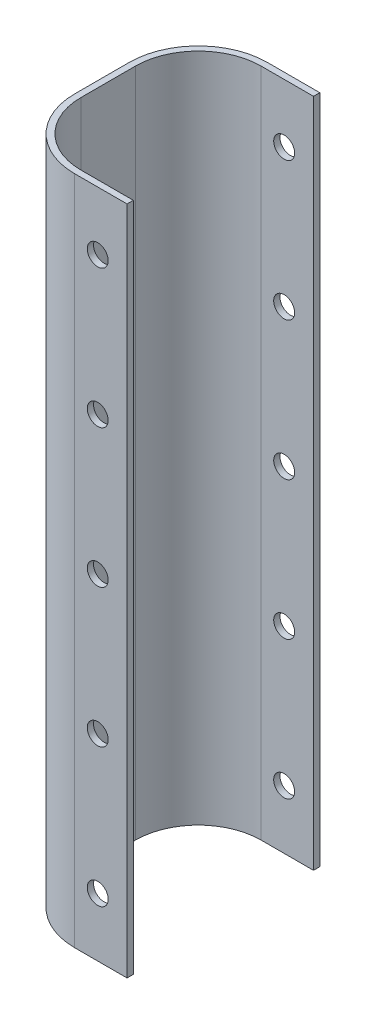
ISO-10303-21;
HEADER;
FILE_DESCRIPTION(('STEP AP214'),'2;1');
FILE_NAME('part.step','',(''),(''),'','','');
FILE_SCHEMA(('AUTOMOTIVE_DESIGN { 1 0 10303 214 1 1 1 1 }'));
ENDSEC;
DATA;
#1=APPLICATION_CONTEXT('core data for automotive mechanical design processes');
#2=APPLICATION_PROTOCOL_DEFINITION('international standard','automotive_design',2000,#1);
#3=PRODUCT_CONTEXT('',#1,'mechanical');
#4=PRODUCT('Part','Part','',(#3));
#5=PRODUCT_RELATED_PRODUCT_CATEGORY('part','',(#4));
#6=PRODUCT_DEFINITION_FORMATION('','',#4);
#7=PRODUCT_DEFINITION_CONTEXT('part definition',#1,'design');
#8=PRODUCT_DEFINITION('design','',#6,#7);
#9=PRODUCT_DEFINITION_SHAPE('','',#8);
#10=(LENGTH_UNIT() NAMED_UNIT(*) SI_UNIT(.MILLI.,.METRE.));
#11=(NAMED_UNIT(*) PLANE_ANGLE_UNIT() SI_UNIT($,.RADIAN.));
#12=(NAMED_UNIT(*) SI_UNIT($,.STERADIAN.) SOLID_ANGLE_UNIT());
#13=UNCERTAINTY_MEASURE_WITH_UNIT(LENGTH_MEASURE(1.E-05),#10,'distance_accuracy_value','');
#14=(GEOMETRIC_REPRESENTATION_CONTEXT(3) GLOBAL_UNCERTAINTY_ASSIGNED_CONTEXT((#13)) GLOBAL_UNIT_ASSIGNED_CONTEXT((#10,
#11,#12)) REPRESENTATION_CONTEXT('',''));
#15=CARTESIAN_POINT('',(0.,0.,0.));
#16=DIRECTION('',(0.,0.,1.));
#17=DIRECTION('',(1.,0.,0.));
#18=AXIS2_PLACEMENT_3D('',#15,#16,#17);
#19=CARTESIAN_POINT('',(0.,160.,0.));
#20=DIRECTION('',(-1.,0.,0.));
#21=DIRECTION('',(0.,0.,1.));
#22=AXIS2_PLACEMENT_3D('',#19,#20,#21);
#23=PLANE('',#22);
#24=DIRECTION('',(0.,0.,-1.));
#25=VECTOR('',#24,1.);
#26=CARTESIAN_POINT('',(0.,0.,0.));
#27=LINE('',#26,#25);
#28=CARTESIAN_POINT('',(0.,0.,0.));
#29=VERTEX_POINT('',#28);
#30=CARTESIAN_POINT('',(0.,0.,-1.5));
#31=VERTEX_POINT('',#30);
#32=EDGE_CURVE('E157',#29,#31,#27,.T.);
#33=ORIENTED_EDGE('',*,*,#32,.T.);
#34=DIRECTION('',(0.,-1.,0.));
#35=VECTOR('',#34,1.);
#36=CARTESIAN_POINT('',(0.,160.,-1.5));
#37=LINE('',#36,#35);
#38=CARTESIAN_POINT('',(0.,160.,-1.5));
#39=VERTEX_POINT('',#38);
#40=EDGE_CURVE('E11',#39,#31,#37,.T.);
#41=ORIENTED_EDGE('',*,*,#40,.F.);
#42=DIRECTION('',(0.,0.,-1.));
#43=VECTOR('',#42,1.);
#44=CARTESIAN_POINT('',(0.,160.,0.));
#45=LINE('',#44,#43);
#46=CARTESIAN_POINT('',(0.,160.,0.));
#47=VERTEX_POINT('',#46);
#48=EDGE_CURVE('E180',#47,#39,#45,.T.);
#49=ORIENTED_EDGE('',*,*,#48,.F.);
#50=DIRECTION('',(0.,-1.,0.));
#51=VECTOR('',#50,1.);
#52=CARTESIAN_POINT('',(0.,160.,0.));
#53=LINE('',#52,#51);
#54=EDGE_CURVE('E153',#47,#29,#53,.T.);
#55=ORIENTED_EDGE('',*,*,#54,.T.);
#56=EDGE_LOOP('',(#33,#41,#49,#55));
#57=FACE_BOUND('',#56,.T.);
#58=ADVANCED_FACE('F35',(#57),#23,.F.);
#59=CARTESIAN_POINT('',(0.,160.,-1.5));
#60=DIRECTION('',(0.,0.,1.));
#61=DIRECTION('',(1.,0.,0.));
#62=AXIS2_PLACEMENT_3D('',#59,#60,#61);
#63=PLANE('',#62);
#64=CARTESIAN_POINT('',(-6.99999999999999,113.,-1.5));
#65=DIRECTION('',(0.,0.,1.));
#66=DIRECTION('',(-1.,0.,0.));
#67=AXIS2_PLACEMENT_3D('',#64,#65,#66);
#68=CIRCLE('',#67,2.5);
#69=CARTESIAN_POINT('',(-9.5,113.,-1.5));
#70=VERTEX_POINT('',#69);
#71=EDGE_CURVE('E478',#70,#70,#68,.T.);
#72=ORIENTED_EDGE('',*,*,#71,.T.);
#73=EDGE_LOOP('',(#72));
#74=FACE_BOUND('',#73,.T.);
#75=CARTESIAN_POINT('',(-7.,146.,-1.5));
#76=DIRECTION('',(0.,0.,1.));
#77=DIRECTION('',(-1.,0.,0.));
#78=AXIS2_PLACEMENT_3D('',#75,#76,#77);
#79=CIRCLE('',#78,2.50000000000001);
#80=CARTESIAN_POINT('',(-9.50000000000001,146.,-1.5));
#81=VERTEX_POINT('',#80);
#82=EDGE_CURVE('E483',#81,#81,#79,.T.);
#83=ORIENTED_EDGE('',*,*,#82,.T.);
#84=EDGE_LOOP('',(#83));
#85=FACE_BOUND('',#84,.T.);
#86=CARTESIAN_POINT('',(-6.99999999999998,14.,-1.5));
#87=DIRECTION('',(0.,0.,1.));
#88=DIRECTION('',(1.,0.,0.));
#89=AXIS2_PLACEMENT_3D('',#86,#87,#88);
#90=CIRCLE('',#89,2.5);
#91=CARTESIAN_POINT('',(-4.49999999999998,14.,-1.5));
#92=VERTEX_POINT('',#91);
#93=EDGE_CURVE('E489',#92,#92,#90,.T.);
#94=ORIENTED_EDGE('',*,*,#93,.T.);
#95=EDGE_LOOP('',(#94));
#96=FACE_BOUND('',#95,.T.);
#97=CARTESIAN_POINT('',(-6.99999999999999,47.,-1.5));
#98=DIRECTION('',(0.,0.,1.));
#99=DIRECTION('',(1.,0.,0.));
#100=AXIS2_PLACEMENT_3D('',#97,#98,#99);
#101=CIRCLE('',#100,2.5);
#102=CARTESIAN_POINT('',(-4.49999999999999,47.,-1.5));
#103=VERTEX_POINT('',#102);
#104=EDGE_CURVE('E474',#103,#103,#101,.T.);
#105=ORIENTED_EDGE('',*,*,#104,.T.);
#106=EDGE_LOOP('',(#105));
#107=FACE_BOUND('',#106,.T.);
#108=CARTESIAN_POINT('',(-6.99999999999999,80.,-1.5));
#109=DIRECTION('',(0.,0.,1.));
#110=DIRECTION('',(1.,0.,0.));
#111=AXIS2_PLACEMENT_3D('',#108,#109,#110);
#112=CIRCLE('',#111,2.5);
#113=CARTESIAN_POINT('',(-4.49999999999999,80.,-1.5));
#114=VERTEX_POINT('',#113);
#115=EDGE_CURVE('E208',#114,#114,#112,.T.);
#116=ORIENTED_EDGE('',*,*,#115,.T.);
#117=EDGE_LOOP('',(#116));
#118=FACE_BOUND('',#117,.T.);
#119=DIRECTION('',(-1.,0.,0.));
#120=VECTOR('',#119,1.);
#121=CARTESIAN_POINT('',(0.,0.,-1.5));
#122=LINE('',#121,#120);
#123=CARTESIAN_POINT('',(-12.5,0.,-1.5));
#124=VERTEX_POINT('',#123);
#125=EDGE_CURVE('E160',#31,#124,#122,.T.);
#126=ORIENTED_EDGE('',*,*,#125,.T.);
#127=DIRECTION('',(0.,-1.,0.));
#128=VECTOR('',#127,1.);
#129=CARTESIAN_POINT('',(-12.5,160.,-1.5));
#130=LINE('',#129,#128);
#131=CARTESIAN_POINT('',(-12.5,160.,-1.5));
#132=VERTEX_POINT('',#131);
#133=EDGE_CURVE('E44',#132,#124,#130,.T.);
#134=ORIENTED_EDGE('',*,*,#133,.F.);
#135=DIRECTION('',(-1.,0.,0.));
#136=VECTOR('',#135,1.);
#137=CARTESIAN_POINT('',(0.,160.,-1.5));
#138=LINE('',#137,#136);
#139=EDGE_CURVE('E108',#39,#132,#138,.T.);
#140=ORIENTED_EDGE('',*,*,#139,.F.);
#141=ORIENTED_EDGE('',*,*,#40,.T.);
#142=EDGE_LOOP('',(#126,#134,#140,#141));
#143=FACE_BOUND('',#142,.T.);
#144=ADVANCED_FACE('F275',(#74,#85,#96,#107,#118,#143),#63,.F.);
#145=CARTESIAN_POINT('',(-12.5,160.,15.));
#146=DIRECTION('',(0.,-1.,0.));
#147=DIRECTION('',(0.,0.,-1.));
#148=AXIS2_PLACEMENT_3D('',#145,#146,#147);
#149=CYLINDRICAL_SURFACE('',#148,16.5);
#150=CARTESIAN_POINT('',(-12.5,0.,15.));
#151=DIRECTION('',(0.,1.,0.));
#152=DIRECTION('',(0.,0.,-1.));
#153=AXIS2_PLACEMENT_3D('',#150,#151,#152);
#154=CIRCLE('',#153,16.5);
#155=CARTESIAN_POINT('',(-29.,0.,15.));
#156=VERTEX_POINT('',#155);
#157=EDGE_CURVE('E163',#124,#156,#154,.T.);
#158=ORIENTED_EDGE('',*,*,#157,.T.);
#159=DIRECTION('',(0.,-1.,0.));
#160=VECTOR('',#159,1.);
#161=CARTESIAN_POINT('',(-29.,160.,15.));
#162=LINE('',#161,#160);
#163=CARTESIAN_POINT('',(-29.,160.,15.));
#164=VERTEX_POINT('',#163);
#165=EDGE_CURVE('E199',#164,#156,#162,.T.);
#166=ORIENTED_EDGE('',*,*,#165,.F.);
#167=CARTESIAN_POINT('',(-12.5,160.,15.));
#168=DIRECTION('',(0.,1.,0.));
#169=DIRECTION('',(0.,0.,-1.));
#170=AXIS2_PLACEMENT_3D('',#167,#168,#169);
#171=CIRCLE('',#170,16.5);
#172=EDGE_CURVE('E234',#132,#164,#171,.T.);
#173=ORIENTED_EDGE('',*,*,#172,.F.);
#174=ORIENTED_EDGE('',*,*,#133,.T.);
#175=EDGE_LOOP('',(#158,#166,#173,#174));
#176=FACE_BOUND('',#175,.T.);
#177=ADVANCED_FACE('F279',(#176),#149,.T.);
#178=CARTESIAN_POINT('',(-29.,160.,15.));
#179=DIRECTION('',(1.,0.,0.));
#180=DIRECTION('',(0.,0.,-1.));
#181=AXIS2_PLACEMENT_3D('',#178,#179,#180);
#182=PLANE('',#181);
#183=DIRECTION('',(0.,0.,1.));
#184=VECTOR('',#183,1.);
#185=CARTESIAN_POINT('',(-29.,0.,15.));
#186=LINE('',#185,#184);
#187=CARTESIAN_POINT('',(-29.,0.,28.));
#188=VERTEX_POINT('',#187);
#189=EDGE_CURVE('E165',#156,#188,#186,.T.);
#190=ORIENTED_EDGE('',*,*,#189,.T.);
#191=DIRECTION('',(0.,-1.,0.));
#192=VECTOR('',#191,1.);
#193=CARTESIAN_POINT('',(-29.,160.,28.));
#194=LINE('',#193,#192);
#195=CARTESIAN_POINT('',(-29.,160.,28.));
#196=VERTEX_POINT('',#195);
#197=EDGE_CURVE('E196',#196,#188,#194,.T.);
#198=ORIENTED_EDGE('',*,*,#197,.F.);
#199=DIRECTION('',(0.,0.,1.));
#200=VECTOR('',#199,1.);
#201=CARTESIAN_POINT('',(-29.,160.,15.));
#202=LINE('',#201,#200);
#203=EDGE_CURVE('E236',#164,#196,#202,.T.);
#204=ORIENTED_EDGE('',*,*,#203,.F.);
#205=ORIENTED_EDGE('',*,*,#165,.T.);
#206=EDGE_LOOP('',(#190,#198,#204,#205));
#207=FACE_BOUND('',#206,.T.);
#208=ADVANCED_FACE('F284',(#207),#182,.F.);
#209=CARTESIAN_POINT('',(-12.5,160.,28.));
#210=DIRECTION('',(0.,-1.,0.));
#211=DIRECTION('',(0.,0.,-1.));
#212=AXIS2_PLACEMENT_3D('',#209,#210,#211);
#213=CYLINDRICAL_SURFACE('',#212,16.5);
#214=CARTESIAN_POINT('',(-12.5,0.,28.));
#215=DIRECTION('',(0.,1.,0.));
#216=DIRECTION('',(0.,0.,-1.));
#217=AXIS2_PLACEMENT_3D('',#214,#215,#216);
#218=CIRCLE('',#217,16.5);
#219=CARTESIAN_POINT('',(-12.5,0.,44.5));
#220=VERTEX_POINT('',#219);
#221=EDGE_CURVE('E167',#188,#220,#218,.T.);
#222=ORIENTED_EDGE('',*,*,#221,.T.);
#223=DIRECTION('',(0.,-1.,0.));
#224=VECTOR('',#223,1.);
#225=CARTESIAN_POINT('',(-12.5,160.,44.5));
#226=LINE('',#225,#224);
#227=CARTESIAN_POINT('',(-12.5,160.,44.5));
#228=VERTEX_POINT('',#227);
#229=EDGE_CURVE('E193',#228,#220,#226,.T.);
#230=ORIENTED_EDGE('',*,*,#229,.F.);
#231=CARTESIAN_POINT('',(-12.5,160.,28.));
#232=DIRECTION('',(0.,1.,0.));
#233=DIRECTION('',(0.,0.,-1.));
#234=AXIS2_PLACEMENT_3D('',#231,#232,#233);
#235=CIRCLE('',#234,16.5);
#236=EDGE_CURVE('E238',#196,#228,#235,.T.);
#237=ORIENTED_EDGE('',*,*,#236,.F.);
#238=ORIENTED_EDGE('',*,*,#197,.T.);
#239=EDGE_LOOP('',(#222,#230,#237,#238));
#240=FACE_BOUND('',#239,.T.);
#241=ADVANCED_FACE('F292',(#240),#213,.T.);
#242=CARTESIAN_POINT('',(-12.5,160.,44.5));
#243=DIRECTION('',(0.,0.,-1.));
#244=DIRECTION('',(-1.,0.,0.));
#245=AXIS2_PLACEMENT_3D('',#242,#243,#244);
#246=PLANE('',#245);
#247=CARTESIAN_POINT('',(-6.99999999999999,113.,44.5));
#248=DIRECTION('',(0.,0.,1.));
#249=DIRECTION('',(-1.,0.,0.));
#250=AXIS2_PLACEMENT_3D('',#247,#248,#249);
#251=CIRCLE('',#250,2.5);
#252=CARTESIAN_POINT('',(-9.5,113.,44.5));
#253=VERTEX_POINT('',#252);
#254=EDGE_CURVE('E459',#253,#253,#251,.T.);
#255=ORIENTED_EDGE('',*,*,#254,.F.);
#256=EDGE_LOOP('',(#255));
#257=FACE_BOUND('',#256,.T.);
#258=CARTESIAN_POINT('',(-7.,146.,44.5));
#259=DIRECTION('',(0.,0.,1.));
#260=DIRECTION('',(-1.,0.,0.));
#261=AXIS2_PLACEMENT_3D('',#258,#259,#260);
#262=CIRCLE('',#261,2.50000000000001);
#263=CARTESIAN_POINT('',(-9.50000000000001,146.,44.5));
#264=VERTEX_POINT('',#263);
#265=EDGE_CURVE('E480',#264,#264,#262,.T.);
#266=ORIENTED_EDGE('',*,*,#265,.F.);
#267=EDGE_LOOP('',(#266));
#268=FACE_BOUND('',#267,.T.);
#269=CARTESIAN_POINT('',(-6.99999999999998,14.,44.5));
#270=DIRECTION('',(0.,0.,1.));
#271=DIRECTION('',(1.,0.,0.));
#272=AXIS2_PLACEMENT_3D('',#269,#270,#271);
#273=CIRCLE('',#272,2.5);
#274=CARTESIAN_POINT('',(-4.49999999999998,14.,44.5));
#275=VERTEX_POINT('',#274);
#276=EDGE_CURVE('E486',#275,#275,#273,.T.);
#277=ORIENTED_EDGE('',*,*,#276,.F.);
#278=EDGE_LOOP('',(#277));
#279=FACE_BOUND('',#278,.T.);
#280=CARTESIAN_POINT('',(-6.99999999999999,47.,44.5));
#281=DIRECTION('',(0.,0.,1.));
#282=DIRECTION('',(1.,0.,0.));
#283=AXIS2_PLACEMENT_3D('',#280,#281,#282);
#284=CIRCLE('',#283,2.5);
#285=CARTESIAN_POINT('',(-4.49999999999999,47.,44.5));
#286=VERTEX_POINT('',#285);
#287=EDGE_CURVE('E492',#286,#286,#284,.T.);
#288=ORIENTED_EDGE('',*,*,#287,.F.);
#289=EDGE_LOOP('',(#288));
#290=FACE_BOUND('',#289,.T.);
#291=CARTESIAN_POINT('',(-6.99999999999999,80.,44.5));
#292=DIRECTION('',(0.,0.,1.));
#293=DIRECTION('',(1.,0.,0.));
#294=AXIS2_PLACEMENT_3D('',#291,#292,#293);
#295=CIRCLE('',#294,2.5);
#296=CARTESIAN_POINT('',(-4.49999999999999,80.,44.5));
#297=VERTEX_POINT('',#296);
#298=EDGE_CURVE('E471',#297,#297,#295,.T.);
#299=ORIENTED_EDGE('',*,*,#298,.F.);
#300=EDGE_LOOP('',(#299));
#301=FACE_BOUND('',#300,.T.);
#302=DIRECTION('',(1.,0.,0.));
#303=VECTOR('',#302,1.);
#304=CARTESIAN_POINT('',(-12.5,0.,44.5));
#305=LINE('',#304,#303);
#306=CARTESIAN_POINT('',(0.,0.,44.5));
#307=VERTEX_POINT('',#306);
#308=EDGE_CURVE('E169',#220,#307,#305,.T.);
#309=ORIENTED_EDGE('',*,*,#308,.T.);
#310=DIRECTION('',(0.,-1.,0.));
#311=VECTOR('',#310,1.);
#312=CARTESIAN_POINT('',(0.,160.,44.5));
#313=LINE('',#312,#311);
#314=CARTESIAN_POINT('',(0.,160.,44.5));
#315=VERTEX_POINT('',#314);
#316=EDGE_CURVE('E190',#315,#307,#313,.T.);
#317=ORIENTED_EDGE('',*,*,#316,.F.);
#318=DIRECTION('',(1.,0.,0.));
#319=VECTOR('',#318,1.);
#320=CARTESIAN_POINT('',(-12.5,160.,44.5));
#321=LINE('',#320,#319);
#322=EDGE_CURVE('E240',#228,#315,#321,.T.);
#323=ORIENTED_EDGE('',*,*,#322,.F.);
#324=ORIENTED_EDGE('',*,*,#229,.T.);
#325=EDGE_LOOP('',(#309,#317,#323,#324));
#326=FACE_BOUND('',#325,.T.);
#327=ADVANCED_FACE('F296',(#257,#268,#279,#290,#301,#326),#246,.F.);
#328=CARTESIAN_POINT('',(0.,160.,44.5));
#329=DIRECTION('',(-1.,0.,0.));
#330=DIRECTION('',(0.,0.,1.));
#331=AXIS2_PLACEMENT_3D('',#328,#329,#330);
#332=PLANE('',#331);
#333=DIRECTION('',(0.,0.,-1.));
#334=VECTOR('',#333,1.);
#335=CARTESIAN_POINT('',(0.,0.,44.5));
#336=LINE('',#335,#334);
#337=CARTESIAN_POINT('',(0.,0.,43.));
#338=VERTEX_POINT('',#337);
#339=EDGE_CURVE('E171',#307,#338,#336,.T.);
#340=ORIENTED_EDGE('',*,*,#339,.T.);
#341=DIRECTION('',(0.,-1.,0.));
#342=VECTOR('',#341,1.);
#343=CARTESIAN_POINT('',(0.,160.,43.));
#344=LINE('',#343,#342);
#345=CARTESIAN_POINT('',(0.,160.,43.));
#346=VERTEX_POINT('',#345);
#347=EDGE_CURVE('E187',#346,#338,#344,.T.);
#348=ORIENTED_EDGE('',*,*,#347,.F.);
#349=DIRECTION('',(0.,0.,-1.));
#350=VECTOR('',#349,1.);
#351=CARTESIAN_POINT('',(0.,160.,44.5));
#352=LINE('',#351,#350);
#353=EDGE_CURVE('E242',#315,#346,#352,.T.);
#354=ORIENTED_EDGE('',*,*,#353,.F.);
#355=ORIENTED_EDGE('',*,*,#316,.T.);
#356=EDGE_LOOP('',(#340,#348,#354,#355));
#357=FACE_BOUND('',#356,.T.);
#358=ADVANCED_FACE('F300',(#357),#332,.F.);
#359=CARTESIAN_POINT('',(-12.5,160.,43.));
#360=DIRECTION('',(0.,0.,1.));
#361=DIRECTION('',(1.,0.,0.));
#362=AXIS2_PLACEMENT_3D('',#359,#360,#361);
#363=PLANE('',#362);
#364=CARTESIAN_POINT('',(-6.99999999999999,113.,43.));
#365=DIRECTION('',(0.,0.,1.));
#366=DIRECTION('',(1.,0.,0.));
#367=AXIS2_PLACEMENT_3D('',#364,#365,#366);
#368=CIRCLE('',#367,2.5);
#369=CARTESIAN_POINT('',(-4.49999999999999,113.,43.));
#370=VERTEX_POINT('',#369);
#371=EDGE_CURVE('E161',#370,#370,#368,.T.);
#372=ORIENTED_EDGE('',*,*,#371,.T.);
#373=EDGE_LOOP('',(#372));
#374=FACE_BOUND('',#373,.T.);
#375=CARTESIAN_POINT('',(-7.,146.,43.));
#376=DIRECTION('',(0.,0.,1.));
#377=DIRECTION('',(1.,0.,0.));
#378=AXIS2_PLACEMENT_3D('',#375,#376,#377);
#379=CIRCLE('',#378,2.50000000000001);
#380=CARTESIAN_POINT('',(-4.49999999999999,146.,43.));
#381=VERTEX_POINT('',#380);
#382=EDGE_CURVE('E218',#381,#381,#379,.T.);
#383=ORIENTED_EDGE('',*,*,#382,.T.);
#384=EDGE_LOOP('',(#383));
#385=FACE_BOUND('',#384,.T.);
#386=CARTESIAN_POINT('',(-6.99999999999998,14.,43.));
#387=DIRECTION('',(0.,0.,1.));
#388=DIRECTION('',(1.,0.,0.));
#389=AXIS2_PLACEMENT_3D('',#386,#387,#388);
#390=CIRCLE('',#389,2.5);
#391=CARTESIAN_POINT('',(-4.49999999999998,14.,43.));
#392=VERTEX_POINT('',#391);
#393=EDGE_CURVE('E215',#392,#392,#390,.T.);
#394=ORIENTED_EDGE('',*,*,#393,.T.);
#395=EDGE_LOOP('',(#394));
#396=FACE_BOUND('',#395,.T.);
#397=CARTESIAN_POINT('',(-6.99999999999999,47.,43.));
#398=DIRECTION('',(0.,0.,1.));
#399=DIRECTION('',(1.,0.,0.));
#400=AXIS2_PLACEMENT_3D('',#397,#398,#399);
#401=CIRCLE('',#400,2.5);
#402=CARTESIAN_POINT('',(-4.49999999999999,47.,43.));
#403=VERTEX_POINT('',#402);
#404=EDGE_CURVE('E212',#403,#403,#401,.T.);
#405=ORIENTED_EDGE('',*,*,#404,.T.);
#406=EDGE_LOOP('',(#405));
#407=FACE_BOUND('',#406,.T.);
#408=CARTESIAN_POINT('',(-6.99999999999999,80.,43.));
#409=DIRECTION('',(0.,0.,1.));
#410=DIRECTION('',(1.,0.,0.));
#411=AXIS2_PLACEMENT_3D('',#408,#409,#410);
#412=CIRCLE('',#411,2.5);
#413=CARTESIAN_POINT('',(-4.49999999999999,80.,43.));
#414=VERTEX_POINT('',#413);
#415=EDGE_CURVE('E207',#414,#414,#412,.T.);
#416=ORIENTED_EDGE('',*,*,#415,.T.);
#417=EDGE_LOOP('',(#416));
#418=FACE_BOUND('',#417,.T.);
#419=DIRECTION('',(-1.,0.,0.));
#420=VECTOR('',#419,1.);
#421=CARTESIAN_POINT('',(-12.5,0.,43.));
#422=LINE('',#421,#420);
#423=CARTESIAN_POINT('',(-12.5,0.,43.));
#424=VERTEX_POINT('',#423);
#425=EDGE_CURVE('E173',#338,#424,#422,.T.);
#426=ORIENTED_EDGE('',*,*,#425,.T.);
#427=DIRECTION('',(0.,-1.,0.));
#428=VECTOR('',#427,1.);
#429=CARTESIAN_POINT('',(-12.5,160.,43.));
#430=LINE('',#429,#428);
#431=CARTESIAN_POINT('',(-12.5,160.,43.));
#432=VERTEX_POINT('',#431);
#433=EDGE_CURVE('E184',#432,#424,#430,.T.);
#434=ORIENTED_EDGE('',*,*,#433,.F.);
#435=DIRECTION('',(-1.,0.,0.));
#436=VECTOR('',#435,1.);
#437=CARTESIAN_POINT('',(-12.5,160.,43.));
#438=LINE('',#437,#436);
#439=EDGE_CURVE('E244',#346,#432,#438,.T.);
#440=ORIENTED_EDGE('',*,*,#439,.F.);
#441=ORIENTED_EDGE('',*,*,#347,.T.);
#442=EDGE_LOOP('',(#426,#434,#440,#441));
#443=FACE_BOUND('',#442,.T.);
#444=ADVANCED_FACE('F250',(#374,#385,#396,#407,#418,#443),#363,.F.);
#445=CARTESIAN_POINT('',(-12.5,160.,28.));
#446=DIRECTION('',(0.,-1.,0.));
#447=DIRECTION('',(0.,0.,-1.));
#448=AXIS2_PLACEMENT_3D('',#445,#446,#447);
#449=CYLINDRICAL_SURFACE('',#448,15.);
#450=CARTESIAN_POINT('',(-12.5,0.,28.));
#451=DIRECTION('',(0.,-1.,0.));
#452=DIRECTION('',(0.,0.,-1.));
#453=AXIS2_PLACEMENT_3D('',#450,#451,#452);
#454=CIRCLE('',#453,15.);
#455=CARTESIAN_POINT('',(-27.5,0.,28.));
#456=VERTEX_POINT('',#455);
#457=EDGE_CURVE('E175',#424,#456,#454,.T.);
#458=ORIENTED_EDGE('',*,*,#457,.T.);
#459=DIRECTION('',(0.,-1.,0.));
#460=VECTOR('',#459,1.);
#461=CARTESIAN_POINT('',(-27.5,160.,28.));
#462=LINE('',#461,#460);
#463=CARTESIAN_POINT('',(-27.5,160.,28.));
#464=VERTEX_POINT('',#463);
#465=EDGE_CURVE('E148',#464,#456,#462,.T.);
#466=ORIENTED_EDGE('',*,*,#465,.F.);
#467=CARTESIAN_POINT('',(-12.5,160.,28.));
#468=DIRECTION('',(0.,-1.,0.));
#469=DIRECTION('',(0.,0.,-1.));
#470=AXIS2_PLACEMENT_3D('',#467,#468,#469);
#471=CIRCLE('',#470,15.);
#472=EDGE_CURVE('E139',#432,#464,#471,.T.);
#473=ORIENTED_EDGE('',*,*,#472,.F.);
#474=ORIENTED_EDGE('',*,*,#433,.T.);
#475=EDGE_LOOP('',(#458,#466,#473,#474));
#476=FACE_BOUND('',#475,.T.);
#477=ADVANCED_FACE('F254',(#476),#449,.F.);
#478=CARTESIAN_POINT('',(-27.5,160.,15.));
#479=DIRECTION('',(-1.,0.,0.));
#480=DIRECTION('',(0.,0.,1.));
#481=AXIS2_PLACEMENT_3D('',#478,#479,#480);
#482=PLANE('',#481);
#483=DIRECTION('',(0.,0.,-1.));
#484=VECTOR('',#483,1.);
#485=CARTESIAN_POINT('',(-27.5,0.,15.));
#486=LINE('',#485,#484);
#487=CARTESIAN_POINT('',(-27.5,0.,15.));
#488=VERTEX_POINT('',#487);
#489=EDGE_CURVE('E147',#456,#488,#486,.T.);
#490=ORIENTED_EDGE('',*,*,#489,.T.);
#491=DIRECTION('',(0.,-1.,0.));
#492=VECTOR('',#491,1.);
#493=CARTESIAN_POINT('',(-27.5,160.,15.));
#494=LINE('',#493,#492);
#495=CARTESIAN_POINT('',(-27.5,160.,15.));
#496=VERTEX_POINT('',#495);
#497=EDGE_CURVE('E144',#496,#488,#494,.T.);
#498=ORIENTED_EDGE('',*,*,#497,.F.);
#499=DIRECTION('',(0.,0.,-1.));
#500=VECTOR('',#499,1.);
#501=CARTESIAN_POINT('',(-27.5,160.,15.));
#502=LINE('',#501,#500);
#503=EDGE_CURVE('E133',#464,#496,#502,.T.);
#504=ORIENTED_EDGE('',*,*,#503,.F.);
#505=ORIENTED_EDGE('',*,*,#465,.T.);
#506=EDGE_LOOP('',(#490,#498,#504,#505));
#507=FACE_BOUND('',#506,.T.);
#508=ADVANCED_FACE('F145',(#507),#482,.F.);
#509=CARTESIAN_POINT('',(-12.5,160.,15.));
#510=DIRECTION('',(0.,-1.,0.));
#511=DIRECTION('',(0.,0.,-1.));
#512=AXIS2_PLACEMENT_3D('',#509,#510,#511);
#513=CYLINDRICAL_SURFACE('',#512,15.);
#514=CARTESIAN_POINT('',(-12.5,0.,15.));
#515=DIRECTION('',(0.,-1.,0.));
#516=DIRECTION('',(0.,0.,-1.));
#517=AXIS2_PLACEMENT_3D('',#514,#515,#516);
#518=CIRCLE('',#517,15.);
#519=CARTESIAN_POINT('',(-12.5,0.,0.));
#520=VERTEX_POINT('',#519);
#521=EDGE_CURVE('E94',#488,#520,#518,.T.);
#522=ORIENTED_EDGE('',*,*,#521,.T.);
#523=DIRECTION('',(0.,-1.,0.));
#524=VECTOR('',#523,1.);
#525=CARTESIAN_POINT('',(-12.5,160.,0.));
#526=LINE('',#525,#524);
#527=CARTESIAN_POINT('',(-12.5,160.,0.));
#528=VERTEX_POINT('',#527);
#529=EDGE_CURVE('E149',#528,#520,#526,.T.);
#530=ORIENTED_EDGE('',*,*,#529,.F.);
#531=CARTESIAN_POINT('',(-12.5,160.,15.));
#532=DIRECTION('',(0.,-1.,0.));
#533=DIRECTION('',(0.,0.,-1.));
#534=AXIS2_PLACEMENT_3D('',#531,#532,#533);
#535=CIRCLE('',#534,15.);
#536=EDGE_CURVE('E137',#496,#528,#535,.T.);
#537=ORIENTED_EDGE('',*,*,#536,.F.);
#538=ORIENTED_EDGE('',*,*,#497,.T.);
#539=EDGE_LOOP('',(#522,#530,#537,#538));
#540=FACE_BOUND('',#539,.T.);
#541=ADVANCED_FACE('F151',(#540),#513,.F.);
#542=CARTESIAN_POINT('',(0.,160.,0.));
#543=DIRECTION('',(0.,0.,-1.));
#544=DIRECTION('',(-1.,0.,0.));
#545=AXIS2_PLACEMENT_3D('',#542,#543,#544);
#546=PLANE('',#545);
#547=CARTESIAN_POINT('',(-6.99999999999999,113.,0.));
#548=DIRECTION('',(0.,0.,-1.));
#549=DIRECTION('',(-1.,0.,0.));
#550=AXIS2_PLACEMENT_3D('',#547,#548,#549);
#551=CIRCLE('',#550,2.5);
#552=CARTESIAN_POINT('',(-9.5,113.,0.));
#553=VERTEX_POINT('',#552);
#554=EDGE_CURVE('E38',#553,#553,#551,.T.);
#555=ORIENTED_EDGE('',*,*,#554,.T.);
#556=EDGE_LOOP('',(#555));
#557=FACE_BOUND('',#556,.T.);
#558=CARTESIAN_POINT('',(-7.,146.,0.));
#559=DIRECTION('',(0.,0.,-1.));
#560=DIRECTION('',(-1.,0.,0.));
#561=AXIS2_PLACEMENT_3D('',#558,#559,#560);
#562=CIRCLE('',#561,2.50000000000001);
#563=CARTESIAN_POINT('',(-9.50000000000001,146.,0.));
#564=VERTEX_POINT('',#563);
#565=EDGE_CURVE('E216',#564,#564,#562,.T.);
#566=ORIENTED_EDGE('',*,*,#565,.T.);
#567=EDGE_LOOP('',(#566));
#568=FACE_BOUND('',#567,.T.);
#569=CARTESIAN_POINT('',(-6.99999999999998,14.,0.));
#570=DIRECTION('',(0.,0.,-1.));
#571=DIRECTION('',(-1.,0.,0.));
#572=AXIS2_PLACEMENT_3D('',#569,#570,#571);
#573=CIRCLE('',#572,2.5);
#574=CARTESIAN_POINT('',(-9.49999999999998,14.,0.));
#575=VERTEX_POINT('',#574);
#576=EDGE_CURVE('E213',#575,#575,#573,.T.);
#577=ORIENTED_EDGE('',*,*,#576,.T.);
#578=EDGE_LOOP('',(#577));
#579=FACE_BOUND('',#578,.T.);
#580=CARTESIAN_POINT('',(-6.99999999999999,47.,0.));
#581=DIRECTION('',(0.,0.,-1.));
#582=DIRECTION('',(-1.,0.,0.));
#583=AXIS2_PLACEMENT_3D('',#580,#581,#582);
#584=CIRCLE('',#583,2.5);
#585=CARTESIAN_POINT('',(-9.49999999999999,47.,0.));
#586=VERTEX_POINT('',#585);
#587=EDGE_CURVE('E209',#586,#586,#584,.T.);
#588=ORIENTED_EDGE('',*,*,#587,.T.);
#589=EDGE_LOOP('',(#588));
#590=FACE_BOUND('',#589,.T.);
#591=CARTESIAN_POINT('',(-6.99999999999999,80.,0.));
#592=DIRECTION('',(0.,0.,-1.));
#593=DIRECTION('',(-1.,0.,0.));
#594=AXIS2_PLACEMENT_3D('',#591,#592,#593);
#595=CIRCLE('',#594,2.5);
#596=CARTESIAN_POINT('',(-9.49999999999999,80.,0.));
#597=VERTEX_POINT('',#596);
#598=EDGE_CURVE('E204',#597,#597,#595,.T.);
#599=ORIENTED_EDGE('',*,*,#598,.T.);
#600=EDGE_LOOP('',(#599));
#601=FACE_BOUND('',#600,.T.);
#602=DIRECTION('',(1.,0.,0.));
#603=VECTOR('',#602,1.);
#604=CARTESIAN_POINT('',(0.,0.,0.));
#605=LINE('',#604,#603);
#606=EDGE_CURVE('E100',#520,#29,#605,.T.);
#607=ORIENTED_EDGE('',*,*,#606,.T.);
#608=ORIENTED_EDGE('',*,*,#54,.F.);
#609=DIRECTION('',(1.,0.,0.));
#610=VECTOR('',#609,1.);
#611=CARTESIAN_POINT('',(0.,160.,0.));
#612=LINE('',#611,#610);
#613=EDGE_CURVE('E53',#528,#47,#612,.T.);
#614=ORIENTED_EDGE('',*,*,#613,.F.);
#615=ORIENTED_EDGE('',*,*,#529,.T.);
#616=EDGE_LOOP('',(#607,#608,#614,#615));
#617=FACE_BOUND('',#616,.T.);
#618=ADVANCED_FACE('F262',(#557,#568,#579,#590,#601,#617),#546,.F.);
#619=CARTESIAN_POINT('',(-12.5,160.,15.));
#620=DIRECTION('',(0.,-1.,0.));
#621=DIRECTION('',(0.,0.,-1.));
#622=AXIS2_PLACEMENT_3D('',#619,#620,#621);
#623=PLANE('',#622);
#624=ORIENTED_EDGE('',*,*,#48,.T.);
#625=ORIENTED_EDGE('',*,*,#139,.T.);
#626=ORIENTED_EDGE('',*,*,#172,.T.);
#627=ORIENTED_EDGE('',*,*,#203,.T.);
#628=ORIENTED_EDGE('',*,*,#236,.T.);
#629=ORIENTED_EDGE('',*,*,#322,.T.);
#630=ORIENTED_EDGE('',*,*,#353,.T.);
#631=ORIENTED_EDGE('',*,*,#439,.T.);
#632=ORIENTED_EDGE('',*,*,#472,.T.);
#633=ORIENTED_EDGE('',*,*,#503,.T.);
#634=ORIENTED_EDGE('',*,*,#536,.T.);
#635=ORIENTED_EDGE('',*,*,#613,.T.);
#636=EDGE_LOOP('',(#624,#625,#626,#627,#628,#629,#630,#631,#632,#633,#634,#635));
#637=FACE_BOUND('',#636,.T.);
#638=ADVANCED_FACE('F135',(#637),#623,.F.);
#639=CARTESIAN_POINT('',(-12.5,0.,15.));
#640=DIRECTION('',(0.,-1.,0.));
#641=DIRECTION('',(0.,0.,-1.));
#642=AXIS2_PLACEMENT_3D('',#639,#640,#641);
#643=PLANE('',#642);
#644=ORIENTED_EDGE('',*,*,#32,.F.);
#645=ORIENTED_EDGE('',*,*,#606,.F.);
#646=ORIENTED_EDGE('',*,*,#521,.F.);
#647=ORIENTED_EDGE('',*,*,#489,.F.);
#648=ORIENTED_EDGE('',*,*,#457,.F.);
#649=ORIENTED_EDGE('',*,*,#425,.F.);
#650=ORIENTED_EDGE('',*,*,#339,.F.);
#651=ORIENTED_EDGE('',*,*,#308,.F.);
#652=ORIENTED_EDGE('',*,*,#221,.F.);
#653=ORIENTED_EDGE('',*,*,#189,.F.);
#654=ORIENTED_EDGE('',*,*,#157,.F.);
#655=ORIENTED_EDGE('',*,*,#125,.F.);
#656=EDGE_LOOP('',(#644,#645,#646,#647,#648,#649,#650,#651,#652,#653,#654,#655));
#657=FACE_BOUND('',#656,.T.);
#658=ADVANCED_FACE('F257',(#657),#643,.T.);
#659=CARTESIAN_POINT('',(-6.99999999999999,80.,-1.5));
#660=DIRECTION('',(0.,0.,1.));
#661=DIRECTION('',(1.,0.,0.));
#662=AXIS2_PLACEMENT_3D('',#659,#660,#661);
#663=CYLINDRICAL_SURFACE('',#662,2.5);
#664=ORIENTED_EDGE('',*,*,#115,.F.);
#665=EDGE_LOOP('',(#664));
#666=FACE_BOUND('',#665,.T.);
#667=ORIENTED_EDGE('',*,*,#598,.F.);
#668=EDGE_LOOP('',(#667));
#669=FACE_BOUND('',#668,.T.);
#670=ADVANCED_FACE('F334',(#666,#669),#663,.F.);
#671=CARTESIAN_POINT('',(-6.99999999999999,47.,-1.5));
#672=DIRECTION('',(0.,0.,1.));
#673=DIRECTION('',(1.,0.,0.));
#674=AXIS2_PLACEMENT_3D('',#671,#672,#673);
#675=CYLINDRICAL_SURFACE('',#674,2.5);
#676=ORIENTED_EDGE('',*,*,#104,.F.);
#677=EDGE_LOOP('',(#676));
#678=FACE_BOUND('',#677,.T.);
#679=ORIENTED_EDGE('',*,*,#587,.F.);
#680=EDGE_LOOP('',(#679));
#681=FACE_BOUND('',#680,.T.);
#682=ADVANCED_FACE('F367',(#678,#681),#675,.F.);
#683=CARTESIAN_POINT('',(-6.99999999999998,14.,-1.5));
#684=DIRECTION('',(0.,0.,1.));
#685=DIRECTION('',(1.,0.,0.));
#686=AXIS2_PLACEMENT_3D('',#683,#684,#685);
#687=CYLINDRICAL_SURFACE('',#686,2.5);
#688=ORIENTED_EDGE('',*,*,#93,.F.);
#689=EDGE_LOOP('',(#688));
#690=FACE_BOUND('',#689,.T.);
#691=ORIENTED_EDGE('',*,*,#576,.F.);
#692=EDGE_LOOP('',(#691));
#693=FACE_BOUND('',#692,.T.);
#694=ADVANCED_FACE('F378',(#690,#693),#687,.F.);
#695=CARTESIAN_POINT('',(-7.,146.,-1.5));
#696=DIRECTION('',(0.,0.,1.));
#697=DIRECTION('',(1.,0.,0.));
#698=AXIS2_PLACEMENT_3D('',#695,#696,#697);
#699=CYLINDRICAL_SURFACE('',#698,2.50000000000001);
#700=ORIENTED_EDGE('',*,*,#82,.F.);
#701=EDGE_LOOP('',(#700));
#702=FACE_BOUND('',#701,.T.);
#703=ORIENTED_EDGE('',*,*,#565,.F.);
#704=EDGE_LOOP('',(#703));
#705=FACE_BOUND('',#704,.T.);
#706=ADVANCED_FACE('F389',(#702,#705),#699,.F.);
#707=CARTESIAN_POINT('',(-6.99999999999999,113.,-1.5));
#708=DIRECTION('',(0.,0.,1.));
#709=DIRECTION('',(1.,0.,0.));
#710=AXIS2_PLACEMENT_3D('',#707,#708,#709);
#711=CYLINDRICAL_SURFACE('',#710,2.5);
#712=ORIENTED_EDGE('',*,*,#71,.F.);
#713=EDGE_LOOP('',(#712));
#714=FACE_BOUND('',#713,.T.);
#715=ORIENTED_EDGE('',*,*,#554,.F.);
#716=EDGE_LOOP('',(#715));
#717=FACE_BOUND('',#716,.T.);
#718=ADVANCED_FACE('F400',(#714,#717),#711,.F.);
#719=ORIENTED_EDGE('',*,*,#298,.T.);
#720=EDGE_LOOP('',(#719));
#721=FACE_BOUND('',#720,.T.);
#722=ORIENTED_EDGE('',*,*,#415,.F.);
#723=EDGE_LOOP('',(#722));
#724=FACE_BOUND('',#723,.T.);
#725=ADVANCED_FACE('F370',(#721,#724),#663,.F.);
#726=ORIENTED_EDGE('',*,*,#287,.T.);
#727=EDGE_LOOP('',(#726));
#728=FACE_BOUND('',#727,.T.);
#729=ORIENTED_EDGE('',*,*,#404,.F.);
#730=EDGE_LOOP('',(#729));
#731=FACE_BOUND('',#730,.T.);
#732=ADVANCED_FACE('F381',(#728,#731),#675,.F.);
#733=ORIENTED_EDGE('',*,*,#276,.T.);
#734=EDGE_LOOP('',(#733));
#735=FACE_BOUND('',#734,.T.);
#736=ORIENTED_EDGE('',*,*,#393,.F.);
#737=EDGE_LOOP('',(#736));
#738=FACE_BOUND('',#737,.T.);
#739=ADVANCED_FACE('F392',(#735,#738),#687,.F.);
#740=ORIENTED_EDGE('',*,*,#265,.T.);
#741=EDGE_LOOP('',(#740));
#742=FACE_BOUND('',#741,.T.);
#743=ORIENTED_EDGE('',*,*,#382,.F.);
#744=EDGE_LOOP('',(#743));
#745=FACE_BOUND('',#744,.T.);
#746=ADVANCED_FACE('F403',(#742,#745),#699,.F.);
#747=ORIENTED_EDGE('',*,*,#254,.T.);
#748=EDGE_LOOP('',(#747));
#749=FACE_BOUND('',#748,.T.);
#750=ORIENTED_EDGE('',*,*,#371,.F.);
#751=EDGE_LOOP('',(#750));
#752=FACE_BOUND('',#751,.T.);
#753=ADVANCED_FACE('F413',(#749,#752),#711,.F.);
#754=CLOSED_SHELL('',(#58,#144,#177,#208,#241,#327,#358,#444,#477,#508,#541,#618,#638,#658,#670,
#682,#694,#706,#718,#725,#732,#739,#746,#753));
#755=MANIFOLD_SOLID_BREP('B2',#754);
#756=ADVANCED_BREP_SHAPE_REPRESENTATION('',(#18,#755),#14);
#757=SHAPE_DEFINITION_REPRESENTATION(#9,#756);
ENDSEC;
END-ISO-10303-21;
